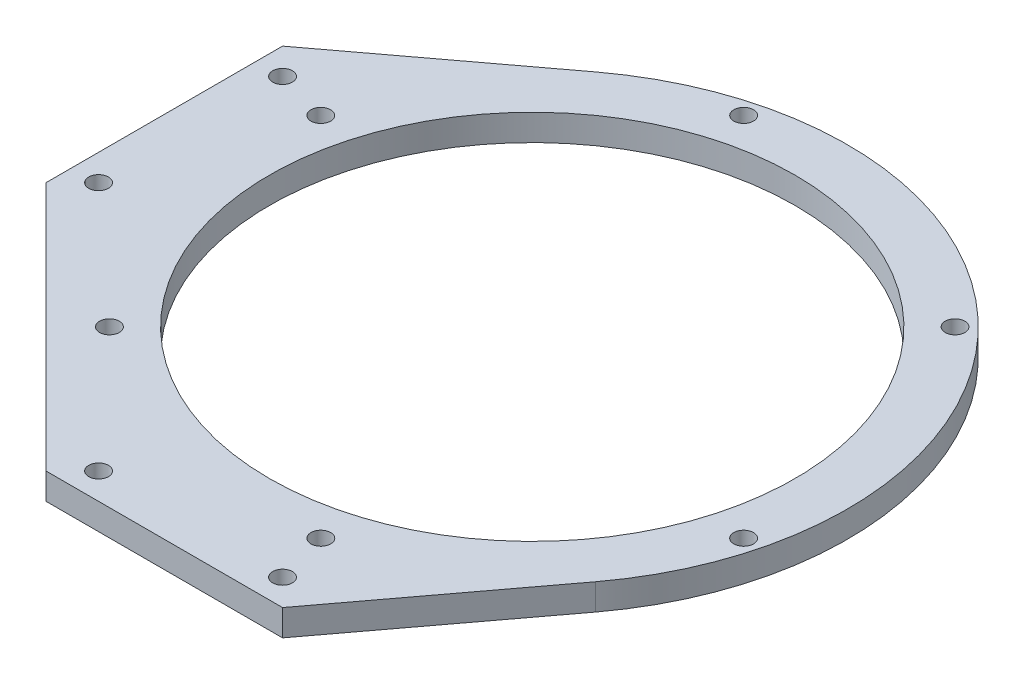
ISO-10303-21;
HEADER;
FILE_DESCRIPTION(('STEP AP214'),'2;1');
FILE_NAME('part.step','',(''),(''),'','','');
FILE_SCHEMA(('AUTOMOTIVE_DESIGN { 1 0 10303 214 1 1 1 1 }'));
ENDSEC;
DATA;
#1=APPLICATION_CONTEXT('core data for automotive mechanical design processes');
#2=APPLICATION_PROTOCOL_DEFINITION('international standard','automotive_design',2000,#1);
#3=PRODUCT_CONTEXT('',#1,'mechanical');
#4=PRODUCT('Part','Part','',(#3));
#5=PRODUCT_RELATED_PRODUCT_CATEGORY('part','',(#4));
#6=PRODUCT_DEFINITION_FORMATION('','',#4);
#7=PRODUCT_DEFINITION_CONTEXT('part definition',#1,'design');
#8=PRODUCT_DEFINITION('design','',#6,#7);
#9=PRODUCT_DEFINITION_SHAPE('','',#8);
#10=(LENGTH_UNIT() NAMED_UNIT(*) SI_UNIT(.MILLI.,.METRE.));
#11=(NAMED_UNIT(*) PLANE_ANGLE_UNIT() SI_UNIT($,.RADIAN.));
#12=(NAMED_UNIT(*) SI_UNIT($,.STERADIAN.) SOLID_ANGLE_UNIT());
#13=UNCERTAINTY_MEASURE_WITH_UNIT(LENGTH_MEASURE(1.E-05),#10,'distance_accuracy_value','');
#14=(GEOMETRIC_REPRESENTATION_CONTEXT(3) GLOBAL_UNCERTAINTY_ASSIGNED_CONTEXT((#13)) GLOBAL_UNIT_ASSIGNED_CONTEXT((#10,
#11,#12)) REPRESENTATION_CONTEXT('',''));
#15=CARTESIAN_POINT('',(0.,0.,0.));
#16=DIRECTION('',(0.,0.,1.));
#17=DIRECTION('',(1.,0.,0.));
#18=AXIS2_PLACEMENT_3D('',#15,#16,#17);
#19=CARTESIAN_POINT('',(0.,4.,0.));
#20=DIRECTION('',(0.,-1.,0.));
#21=DIRECTION('',(0.,0.,-1.));
#22=AXIS2_PLACEMENT_3D('',#19,#20,#21);
#23=PLANE('',#22);
#24=DIRECTION('',(-0.8,0.,0.599999999999999));
#25=VECTOR('',#24,1.);
#26=CARTESIAN_POINT('',(-56.,4.,-18.));
#27=LINE('',#26,#25);
#28=CARTESIAN_POINT('',(-28.8,4.,-38.4));
#29=VERTEX_POINT('',#28);
#30=CARTESIAN_POINT('',(-56.,4.,-18.));
#31=VERTEX_POINT('',#30);
#32=EDGE_CURVE('E131',#29,#31,#27,.T.);
#33=ORIENTED_EDGE('',*,*,#32,.T.);
#34=DIRECTION('',(0.,0.,1.));
#35=VECTOR('',#34,1.);
#36=CARTESIAN_POINT('',(-56.,4.,-18.));
#37=LINE('',#36,#35);
#38=CARTESIAN_POINT('',(-56.,4.,18.));
#39=VERTEX_POINT('',#38);
#40=EDGE_CURVE('E91',#31,#39,#37,.T.);
#41=ORIENTED_EDGE('',*,*,#40,.T.);
#42=DIRECTION('',(0.707106781186548,0.,0.707106781186548));
#43=VECTOR('',#42,1.);
#44=CARTESIAN_POINT('',(-56.,4.,18.));
#45=LINE('',#44,#43);
#46=CARTESIAN_POINT('',(-18.,4.,56.));
#47=VERTEX_POINT('',#46);
#48=EDGE_CURVE('E106',#39,#47,#45,.T.);
#49=ORIENTED_EDGE('',*,*,#48,.T.);
#50=DIRECTION('',(1.,0.,0.));
#51=VECTOR('',#50,1.);
#52=CARTESIAN_POINT('',(18.,4.,56.));
#53=LINE('',#52,#51);
#54=CARTESIAN_POINT('',(18.,4.,56.));
#55=VERTEX_POINT('',#54);
#56=EDGE_CURVE('E99',#47,#55,#53,.T.);
#57=ORIENTED_EDGE('',*,*,#56,.T.);
#58=DIRECTION('',(0.599999999999999,0.,-0.800000000000001));
#59=VECTOR('',#58,1.);
#60=CARTESIAN_POINT('',(18.,4.,56.));
#61=LINE('',#60,#59);
#62=CARTESIAN_POINT('',(38.4,4.,28.8));
#63=VERTEX_POINT('',#62);
#64=EDGE_CURVE('E102',#55,#63,#61,.T.);
#65=ORIENTED_EDGE('',*,*,#64,.T.);
#66=CARTESIAN_POINT('',(0.,4.,0.));
#67=DIRECTION('',(0.,1.,0.));
#68=DIRECTION('',(0.,0.,-1.));
#69=AXIS2_PLACEMENT_3D('',#66,#67,#68);
#70=CIRCLE('',#69,47.9999999999999);
#71=EDGE_CURVE('E57',#63,#29,#70,.T.);
#72=ORIENTED_EDGE('',*,*,#71,.T.);
#73=EDGE_LOOP('',(#33,#41,#49,#57,#65,#72));
#74=FACE_BOUND('',#73,.T.);
#75=CARTESIAN_POINT('',(0.,4.,0.));
#76=DIRECTION('',(0.,1.,0.));
#77=DIRECTION('',(0.,0.,1.));
#78=AXIS2_PLACEMENT_3D('',#75,#76,#77);
#79=CIRCLE('',#78,40.);
#80=CARTESIAN_POINT('',(0.,4.,40.));
#81=VERTEX_POINT('',#80);
#82=EDGE_CURVE('E126',#81,#81,#79,.T.);
#83=ORIENTED_EDGE('',*,*,#82,.F.);
#84=EDGE_LOOP('',(#83));
#85=FACE_BOUND('',#84,.T.);
#86=CARTESIAN_POINT('',(32.1733585439879,4.,-32.1733585439879));
#87=DIRECTION('',(0.,1.,0.));
#88=DIRECTION('',(0.,0.,1.));
#89=AXIS2_PLACEMENT_3D('',#86,#87,#88);
#90=CIRCLE('',#89,1.5);
#91=CARTESIAN_POINT('',(32.1733585439879,4.,-30.6733585439879));
#92=VERTEX_POINT('',#91);
#93=EDGE_CURVE('E267',#92,#92,#90,.T.);
#94=ORIENTED_EDGE('',*,*,#93,.F.);
#95=EDGE_LOOP('',(#94));
#96=FACE_BOUND('',#95,.T.);
#97=CARTESIAN_POINT('',(43.9496250961526,4.,11.7762665521646));
#98=DIRECTION('',(0.,1.,0.));
#99=DIRECTION('',(0.,0.,1.));
#100=AXIS2_PLACEMENT_3D('',#97,#98,#99);
#101=CIRCLE('',#100,1.50000000000001);
#102=CARTESIAN_POINT('',(43.9496250961526,4.,13.2762665521647));
#103=VERTEX_POINT('',#102);
#104=EDGE_CURVE('E263',#103,#103,#101,.T.);
#105=ORIENTED_EDGE('',*,*,#104,.F.);
#106=EDGE_LOOP('',(#105));
#107=FACE_BOUND('',#106,.T.);
#108=CARTESIAN_POINT('',(11.7762665521647,4.,43.9496250961526));
#109=DIRECTION('',(0.,1.,0.));
#110=DIRECTION('',(0.,0.,1.));
#111=AXIS2_PLACEMENT_3D('',#108,#109,#110);
#112=CIRCLE('',#111,1.50000000000001);
#113=CARTESIAN_POINT('',(11.7762665521647,4.,45.4496250961526));
#114=VERTEX_POINT('',#113);
#115=EDGE_CURVE('E260',#114,#114,#112,.T.);
#116=ORIENTED_EDGE('',*,*,#115,.F.);
#117=EDGE_LOOP('',(#116));
#118=FACE_BOUND('',#117,.T.);
#119=CARTESIAN_POINT('',(-32.1733585439879,4.,32.1733585439879));
#120=DIRECTION('',(0.,1.,0.));
#121=DIRECTION('',(0.,0.,1.));
#122=AXIS2_PLACEMENT_3D('',#119,#120,#121);
#123=CIRCLE('',#122,1.50000000000001);
#124=CARTESIAN_POINT('',(-32.1733585439879,4.,33.6733585439879));
#125=VERTEX_POINT('',#124);
#126=EDGE_CURVE('E253',#125,#125,#123,.T.);
#127=ORIENTED_EDGE('',*,*,#126,.F.);
#128=EDGE_LOOP('',(#127));
#129=FACE_BOUND('',#128,.T.);
#130=CARTESIAN_POINT('',(-43.9496250961526,4.,-11.7762665521646));
#131=DIRECTION('',(0.,1.,0.));
#132=DIRECTION('',(0.,0.,1.));
#133=AXIS2_PLACEMENT_3D('',#130,#131,#132);
#134=CIRCLE('',#133,1.50000000000001);
#135=CARTESIAN_POINT('',(-43.9496250961526,4.,-10.2762665521646));
#136=VERTEX_POINT('',#135);
#137=EDGE_CURVE('E241',#136,#136,#134,.T.);
#138=ORIENTED_EDGE('',*,*,#137,.F.);
#139=EDGE_LOOP('',(#138));
#140=FACE_BOUND('',#139,.T.);
#141=CARTESIAN_POINT('',(-11.7762665521648,4.,-43.9496250961526));
#142=DIRECTION('',(0.,1.,0.));
#143=DIRECTION('',(0.,0.,1.));
#144=AXIS2_PLACEMENT_3D('',#141,#142,#143);
#145=CIRCLE('',#144,1.5);
#146=CARTESIAN_POINT('',(-11.7762665521648,4.,-42.4496250961526));
#147=VERTEX_POINT('',#146);
#148=EDGE_CURVE('E239',#147,#147,#145,.T.);
#149=ORIENTED_EDGE('',*,*,#148,.F.);
#150=EDGE_LOOP('',(#149));
#151=FACE_BOUND('',#150,.T.);
#152=CARTESIAN_POINT('',(-14.,4.,52.));
#153=DIRECTION('',(0.,1.,0.));
#154=DIRECTION('',(0.,0.,1.));
#155=AXIS2_PLACEMENT_3D('',#152,#153,#154);
#156=CIRCLE('',#155,1.5);
#157=CARTESIAN_POINT('',(-14.,4.,53.5));
#158=VERTEX_POINT('',#157);
#159=EDGE_CURVE('E234',#158,#158,#156,.T.);
#160=ORIENTED_EDGE('',*,*,#159,.F.);
#161=EDGE_LOOP('',(#160));
#162=FACE_BOUND('',#161,.T.);
#163=CARTESIAN_POINT('',(14.,4.,52.));
#164=DIRECTION('',(0.,1.,0.));
#165=DIRECTION('',(0.,0.,-1.));
#166=AXIS2_PLACEMENT_3D('',#163,#164,#165);
#167=CIRCLE('',#166,1.5);
#168=CARTESIAN_POINT('',(14.,4.,50.5));
#169=VERTEX_POINT('',#168);
#170=EDGE_CURVE('E229',#169,#169,#167,.T.);
#171=ORIENTED_EDGE('',*,*,#170,.F.);
#172=EDGE_LOOP('',(#171));
#173=FACE_BOUND('',#172,.T.);
#174=CARTESIAN_POINT('',(-52.,4.,14.));
#175=DIRECTION('',(0.,1.,0.));
#176=DIRECTION('',(0.,0.,-1.));
#177=AXIS2_PLACEMENT_3D('',#174,#175,#176);
#178=CIRCLE('',#177,1.5);
#179=CARTESIAN_POINT('',(-52.,4.,12.5));
#180=VERTEX_POINT('',#179);
#181=EDGE_CURVE('E222',#180,#180,#178,.T.);
#182=ORIENTED_EDGE('',*,*,#181,.F.);
#183=EDGE_LOOP('',(#182));
#184=FACE_BOUND('',#183,.T.);
#185=CARTESIAN_POINT('',(-52.,4.,-14.));
#186=DIRECTION('',(0.,1.,0.));
#187=DIRECTION('',(0.,0.,1.));
#188=AXIS2_PLACEMENT_3D('',#185,#186,#187);
#189=CIRCLE('',#188,1.5);
#190=CARTESIAN_POINT('',(-52.,4.,-12.5));
#191=VERTEX_POINT('',#190);
#192=EDGE_CURVE('E215',#191,#191,#189,.T.);
#193=ORIENTED_EDGE('',*,*,#192,.F.);
#194=EDGE_LOOP('',(#193));
#195=FACE_BOUND('',#194,.T.);
#196=ADVANCED_FACE('F39',(#74,#85,#96,#107,#118,#129,#140,#151,#162,#173,#184,#195),#23,.F.);
#197=CARTESIAN_POINT('',(0.,0.,0.));
#198=DIRECTION('',(0.,-1.,0.));
#199=DIRECTION('',(0.,0.,-1.));
#200=AXIS2_PLACEMENT_3D('',#197,#198,#199);
#201=PLANE('',#200);
#202=CARTESIAN_POINT('',(-52.,0.,14.));
#203=DIRECTION('',(0.,1.,0.));
#204=DIRECTION('',(0.,0.,-1.));
#205=AXIS2_PLACEMENT_3D('',#202,#203,#204);
#206=CIRCLE('',#205,1.5);
#207=CARTESIAN_POINT('',(-52.,0.,12.5));
#208=VERTEX_POINT('',#207);
#209=EDGE_CURVE('E217',#208,#208,#206,.T.);
#210=ORIENTED_EDGE('',*,*,#209,.T.);
#211=EDGE_LOOP('',(#210));
#212=FACE_BOUND('',#211,.T.);
#213=CARTESIAN_POINT('',(-14.,0.,52.));
#214=DIRECTION('',(0.,1.,0.));
#215=DIRECTION('',(0.,0.,1.));
#216=AXIS2_PLACEMENT_3D('',#213,#214,#215);
#217=CIRCLE('',#216,1.5);
#218=CARTESIAN_POINT('',(-14.,0.,53.5));
#219=VERTEX_POINT('',#218);
#220=EDGE_CURVE('E226',#219,#219,#217,.T.);
#221=ORIENTED_EDGE('',*,*,#220,.T.);
#222=EDGE_LOOP('',(#221));
#223=FACE_BOUND('',#222,.T.);
#224=CARTESIAN_POINT('',(-43.9496250961526,0.,-11.7762665521646));
#225=DIRECTION('',(0.,1.,0.));
#226=DIRECTION('',(0.,0.,1.));
#227=AXIS2_PLACEMENT_3D('',#224,#225,#226);
#228=CIRCLE('',#227,1.50000000000001);
#229=CARTESIAN_POINT('',(-43.9496250961526,0.,-10.2762665521646));
#230=VERTEX_POINT('',#229);
#231=EDGE_CURVE('E244',#230,#230,#228,.T.);
#232=ORIENTED_EDGE('',*,*,#231,.T.);
#233=EDGE_LOOP('',(#232));
#234=FACE_BOUND('',#233,.T.);
#235=CARTESIAN_POINT('',(11.7762665521647,0.,43.9496250961526));
#236=DIRECTION('',(0.,1.,0.));
#237=DIRECTION('',(0.,0.,1.));
#238=AXIS2_PLACEMENT_3D('',#235,#236,#237);
#239=CIRCLE('',#238,1.50000000000001);
#240=CARTESIAN_POINT('',(11.7762665521647,0.,45.4496250961526));
#241=VERTEX_POINT('',#240);
#242=EDGE_CURVE('E255',#241,#241,#239,.T.);
#243=ORIENTED_EDGE('',*,*,#242,.T.);
#244=EDGE_LOOP('',(#243));
#245=FACE_BOUND('',#244,.T.);
#246=CARTESIAN_POINT('',(32.1733585439879,0.,-32.1733585439879));
#247=DIRECTION('',(0.,1.,0.));
#248=DIRECTION('',(0.,0.,1.));
#249=AXIS2_PLACEMENT_3D('',#246,#247,#248);
#250=CIRCLE('',#249,1.5);
#251=CARTESIAN_POINT('',(32.1733585439879,0.,-30.6733585439879));
#252=VERTEX_POINT('',#251);
#253=EDGE_CURVE('E266',#252,#252,#250,.T.);
#254=ORIENTED_EDGE('',*,*,#253,.T.);
#255=EDGE_LOOP('',(#254));
#256=FACE_BOUND('',#255,.T.);
#257=DIRECTION('',(-0.8,0.,0.599999999999999));
#258=VECTOR('',#257,1.);
#259=CARTESIAN_POINT('',(-56.,0.,-18.));
#260=LINE('',#259,#258);
#261=CARTESIAN_POINT('',(-28.8,0.,-38.4));
#262=VERTEX_POINT('',#261);
#263=CARTESIAN_POINT('',(-56.,0.,-18.));
#264=VERTEX_POINT('',#263);
#265=EDGE_CURVE('E121',#262,#264,#260,.T.);
#266=ORIENTED_EDGE('',*,*,#265,.F.);
#267=CARTESIAN_POINT('',(0.,0.,0.));
#268=DIRECTION('',(0.,1.,0.));
#269=DIRECTION('',(0.,0.,-1.));
#270=AXIS2_PLACEMENT_3D('',#267,#268,#269);
#271=CIRCLE('',#270,47.9999999999999);
#272=CARTESIAN_POINT('',(38.4,0.,28.8));
#273=VERTEX_POINT('',#272);
#274=EDGE_CURVE('E83',#273,#262,#271,.T.);
#275=ORIENTED_EDGE('',*,*,#274,.F.);
#276=DIRECTION('',(0.599999999999999,0.,-0.800000000000001));
#277=VECTOR('',#276,1.);
#278=CARTESIAN_POINT('',(18.,0.,56.));
#279=LINE('',#278,#277);
#280=CARTESIAN_POINT('',(18.,0.,56.));
#281=VERTEX_POINT('',#280);
#282=EDGE_CURVE('E80',#281,#273,#279,.T.);
#283=ORIENTED_EDGE('',*,*,#282,.F.);
#284=DIRECTION('',(1.,0.,0.));
#285=VECTOR('',#284,1.);
#286=CARTESIAN_POINT('',(18.,0.,56.));
#287=LINE('',#286,#285);
#288=CARTESIAN_POINT('',(-18.,0.,56.));
#289=VERTEX_POINT('',#288);
#290=EDGE_CURVE('E111',#289,#281,#287,.T.);
#291=ORIENTED_EDGE('',*,*,#290,.F.);
#292=DIRECTION('',(0.707106781186548,0.,0.707106781186548));
#293=VECTOR('',#292,1.);
#294=CARTESIAN_POINT('',(-56.,0.,18.));
#295=LINE('',#294,#293);
#296=CARTESIAN_POINT('',(-56.,0.,18.));
#297=VERTEX_POINT('',#296);
#298=EDGE_CURVE('E128',#297,#289,#295,.T.);
#299=ORIENTED_EDGE('',*,*,#298,.F.);
#300=DIRECTION('',(0.,0.,1.));
#301=VECTOR('',#300,1.);
#302=CARTESIAN_POINT('',(-56.,0.,-18.));
#303=LINE('',#302,#301);
#304=EDGE_CURVE('E130',#264,#297,#303,.T.);
#305=ORIENTED_EDGE('',*,*,#304,.F.);
#306=EDGE_LOOP('',(#266,#275,#283,#291,#299,#305));
#307=FACE_BOUND('',#306,.T.);
#308=CARTESIAN_POINT('',(0.,0.,0.));
#309=DIRECTION('',(0.,1.,0.));
#310=DIRECTION('',(0.,0.,1.));
#311=AXIS2_PLACEMENT_3D('',#308,#309,#310);
#312=CIRCLE('',#311,40.);
#313=CARTESIAN_POINT('',(0.,0.,40.));
#314=VERTEX_POINT('',#313);
#315=EDGE_CURVE('E275',#314,#314,#312,.T.);
#316=ORIENTED_EDGE('',*,*,#315,.T.);
#317=EDGE_LOOP('',(#316));
#318=FACE_BOUND('',#317,.T.);
#319=CARTESIAN_POINT('',(43.9496250961526,0.,11.7762665521646));
#320=DIRECTION('',(0.,1.,0.));
#321=DIRECTION('',(0.,0.,1.));
#322=AXIS2_PLACEMENT_3D('',#319,#320,#321);
#323=CIRCLE('',#322,1.50000000000001);
#324=CARTESIAN_POINT('',(43.9496250961526,0.,13.2762665521647));
#325=VERTEX_POINT('',#324);
#326=EDGE_CURVE('E257',#325,#325,#323,.T.);
#327=ORIENTED_EDGE('',*,*,#326,.T.);
#328=EDGE_LOOP('',(#327));
#329=FACE_BOUND('',#328,.T.);
#330=CARTESIAN_POINT('',(-32.1733585439879,0.,32.1733585439879));
#331=DIRECTION('',(0.,1.,0.));
#332=DIRECTION('',(0.,0.,1.));
#333=AXIS2_PLACEMENT_3D('',#330,#331,#332);
#334=CIRCLE('',#333,1.50000000000001);
#335=CARTESIAN_POINT('',(-32.1733585439879,0.,33.6733585439879));
#336=VERTEX_POINT('',#335);
#337=EDGE_CURVE('E249',#336,#336,#334,.T.);
#338=ORIENTED_EDGE('',*,*,#337,.T.);
#339=EDGE_LOOP('',(#338));
#340=FACE_BOUND('',#339,.T.);
#341=CARTESIAN_POINT('',(-11.7762665521648,0.,-43.9496250961526));
#342=DIRECTION('',(0.,1.,0.));
#343=DIRECTION('',(0.,0.,1.));
#344=AXIS2_PLACEMENT_3D('',#341,#342,#343);
#345=CIRCLE('',#344,1.5);
#346=CARTESIAN_POINT('',(-11.7762665521648,0.,-42.4496250961526));
#347=VERTEX_POINT('',#346);
#348=EDGE_CURVE('E237',#347,#347,#345,.T.);
#349=ORIENTED_EDGE('',*,*,#348,.T.);
#350=EDGE_LOOP('',(#349));
#351=FACE_BOUND('',#350,.T.);
#352=CARTESIAN_POINT('',(14.,0.,52.));
#353=DIRECTION('',(0.,1.,0.));
#354=DIRECTION('',(0.,0.,-1.));
#355=AXIS2_PLACEMENT_3D('',#352,#353,#354);
#356=CIRCLE('',#355,1.5);
#357=CARTESIAN_POINT('',(14.,0.,50.5));
#358=VERTEX_POINT('',#357);
#359=EDGE_CURVE('E221',#358,#358,#356,.T.);
#360=ORIENTED_EDGE('',*,*,#359,.T.);
#361=EDGE_LOOP('',(#360));
#362=FACE_BOUND('',#361,.T.);
#363=CARTESIAN_POINT('',(-52.,0.,-14.));
#364=DIRECTION('',(0.,1.,0.));
#365=DIRECTION('',(0.,0.,1.));
#366=AXIS2_PLACEMENT_3D('',#363,#364,#365);
#367=CIRCLE('',#366,1.5);
#368=CARTESIAN_POINT('',(-52.,0.,-12.5));
#369=VERTEX_POINT('',#368);
#370=EDGE_CURVE('E214',#369,#369,#367,.T.);
#371=ORIENTED_EDGE('',*,*,#370,.T.);
#372=EDGE_LOOP('',(#371));
#373=FACE_BOUND('',#372,.T.);
#374=ADVANCED_FACE('F145',(#212,#223,#234,#245,#256,#307,#318,#329,#340,#351,#362,#373),#201,.T.);
#375=CARTESIAN_POINT('',(-56.,4.,-18.));
#376=DIRECTION('',(0.6,0.,0.800000000000001));
#377=DIRECTION('',(0.8,0.,-0.599999999999999));
#378=AXIS2_PLACEMENT_3D('',#375,#376,#377);
#379=PLANE('',#378);
#380=ORIENTED_EDGE('',*,*,#265,.T.);
#381=DIRECTION('',(0.,-1.,0.));
#382=VECTOR('',#381,1.);
#383=CARTESIAN_POINT('',(-56.,4.,-18.));
#384=LINE('',#383,#382);
#385=EDGE_CURVE('E11',#31,#264,#384,.T.);
#386=ORIENTED_EDGE('',*,*,#385,.F.);
#387=ORIENTED_EDGE('',*,*,#32,.F.);
#388=DIRECTION('',(0.,-1.,0.));
#389=VECTOR('',#388,1.);
#390=CARTESIAN_POINT('',(-28.8,4.,-38.4));
#391=LINE('',#390,#389);
#392=EDGE_CURVE('E116',#29,#262,#391,.T.);
#393=ORIENTED_EDGE('',*,*,#392,.T.);
#394=EDGE_LOOP('',(#380,#386,#387,#393));
#395=FACE_BOUND('',#394,.T.);
#396=ADVANCED_FACE('F41',(#395),#379,.F.);
#397=CARTESIAN_POINT('',(-56.,4.,-18.));
#398=DIRECTION('',(1.,0.,0.));
#399=DIRECTION('',(0.,0.,-1.));
#400=AXIS2_PLACEMENT_3D('',#397,#398,#399);
#401=PLANE('',#400);
#402=ORIENTED_EDGE('',*,*,#304,.T.);
#403=DIRECTION('',(0.,-1.,0.));
#404=VECTOR('',#403,1.);
#405=CARTESIAN_POINT('',(-56.,4.,18.));
#406=LINE('',#405,#404);
#407=EDGE_CURVE('E48',#39,#297,#406,.T.);
#408=ORIENTED_EDGE('',*,*,#407,.F.);
#409=ORIENTED_EDGE('',*,*,#40,.F.);
#410=ORIENTED_EDGE('',*,*,#385,.T.);
#411=EDGE_LOOP('',(#402,#408,#409,#410));
#412=FACE_BOUND('',#411,.T.);
#413=ADVANCED_FACE('F390',(#412),#401,.F.);
#414=CARTESIAN_POINT('',(-56.,4.,18.));
#415=DIRECTION('',(0.707106781186547,0.,-0.707106781186547));
#416=DIRECTION('',(-0.707106781186548,0.,-0.707106781186548));
#417=AXIS2_PLACEMENT_3D('',#414,#415,#416);
#418=PLANE('',#417);
#419=ORIENTED_EDGE('',*,*,#298,.T.);
#420=DIRECTION('',(0.,-1.,0.));
#421=VECTOR('',#420,1.);
#422=CARTESIAN_POINT('',(-18.,4.,56.));
#423=LINE('',#422,#421);
#424=EDGE_CURVE('E113',#47,#289,#423,.T.);
#425=ORIENTED_EDGE('',*,*,#424,.F.);
#426=ORIENTED_EDGE('',*,*,#48,.F.);
#427=ORIENTED_EDGE('',*,*,#407,.T.);
#428=EDGE_LOOP('',(#419,#425,#426,#427));
#429=FACE_BOUND('',#428,.T.);
#430=ADVANCED_FACE('F143',(#429),#418,.F.);
#431=CARTESIAN_POINT('',(18.,4.,56.));
#432=DIRECTION('',(0.,0.,-1.));
#433=DIRECTION('',(-1.,0.,0.));
#434=AXIS2_PLACEMENT_3D('',#431,#432,#433);
#435=PLANE('',#434);
#436=ORIENTED_EDGE('',*,*,#290,.T.);
#437=DIRECTION('',(0.,-1.,0.));
#438=VECTOR('',#437,1.);
#439=CARTESIAN_POINT('',(18.,4.,56.));
#440=LINE('',#439,#438);
#441=EDGE_CURVE('E112',#55,#281,#440,.T.);
#442=ORIENTED_EDGE('',*,*,#441,.F.);
#443=ORIENTED_EDGE('',*,*,#56,.F.);
#444=ORIENTED_EDGE('',*,*,#424,.T.);
#445=EDGE_LOOP('',(#436,#442,#443,#444));
#446=FACE_BOUND('',#445,.T.);
#447=ADVANCED_FACE('F115',(#446),#435,.F.);
#448=CARTESIAN_POINT('',(18.,4.,56.));
#449=DIRECTION('',(-0.800000000000001,0.,-0.599999999999999));
#450=DIRECTION('',(-0.599999999999999,0.,0.800000000000001));
#451=AXIS2_PLACEMENT_3D('',#448,#449,#450);
#452=PLANE('',#451);
#453=ORIENTED_EDGE('',*,*,#282,.T.);
#454=DIRECTION('',(0.,-1.,0.));
#455=VECTOR('',#454,1.);
#456=CARTESIAN_POINT('',(38.4,4.,28.8));
#457=LINE('',#456,#455);
#458=EDGE_CURVE('E118',#63,#273,#457,.T.);
#459=ORIENTED_EDGE('',*,*,#458,.F.);
#460=ORIENTED_EDGE('',*,*,#64,.F.);
#461=ORIENTED_EDGE('',*,*,#441,.T.);
#462=EDGE_LOOP('',(#453,#459,#460,#461));
#463=FACE_BOUND('',#462,.T.);
#464=ADVANCED_FACE('F117',(#463),#452,.F.);
#465=CARTESIAN_POINT('',(0.,4.,0.));
#466=DIRECTION('',(0.,-1.,0.));
#467=DIRECTION('',(0.,0.,-1.));
#468=AXIS2_PLACEMENT_3D('',#465,#466,#467);
#469=CYLINDRICAL_SURFACE('',#468,47.9999999999999);
#470=ORIENTED_EDGE('',*,*,#274,.T.);
#471=ORIENTED_EDGE('',*,*,#392,.F.);
#472=ORIENTED_EDGE('',*,*,#71,.F.);
#473=ORIENTED_EDGE('',*,*,#458,.T.);
#474=EDGE_LOOP('',(#470,#471,#472,#473));
#475=FACE_BOUND('',#474,.T.);
#476=ADVANCED_FACE('F149',(#475),#469,.T.);
#477=CARTESIAN_POINT('',(0.,4.,0.));
#478=DIRECTION('',(0.,-1.,0.));
#479=DIRECTION('',(0.,0.,-1.));
#480=AXIS2_PLACEMENT_3D('',#477,#478,#479);
#481=CYLINDRICAL_SURFACE('',#480,40.);
#482=ORIENTED_EDGE('',*,*,#82,.T.);
#483=EDGE_LOOP('',(#482));
#484=FACE_BOUND('',#483,.T.);
#485=ORIENTED_EDGE('',*,*,#315,.F.);
#486=EDGE_LOOP('',(#485));
#487=FACE_BOUND('',#486,.T.);
#488=ADVANCED_FACE('F151',(#484,#487),#481,.F.);
#489=CARTESIAN_POINT('',(32.1733585439879,4.,-32.1733585439879));
#490=DIRECTION('',(0.,-1.,0.));
#491=DIRECTION('',(0.,0.,-1.));
#492=AXIS2_PLACEMENT_3D('',#489,#490,#491);
#493=CYLINDRICAL_SURFACE('',#492,1.5);
#494=ORIENTED_EDGE('',*,*,#93,.T.);
#495=EDGE_LOOP('',(#494));
#496=FACE_BOUND('',#495,.T.);
#497=ORIENTED_EDGE('',*,*,#253,.F.);
#498=EDGE_LOOP('',(#497));
#499=FACE_BOUND('',#498,.T.);
#500=ADVANCED_FACE('F160',(#496,#499),#493,.F.);
#501=CARTESIAN_POINT('',(43.9496250961526,4.,11.7762665521646));
#502=DIRECTION('',(0.,-1.,0.));
#503=DIRECTION('',(0.,0.,-1.));
#504=AXIS2_PLACEMENT_3D('',#501,#502,#503);
#505=CYLINDRICAL_SURFACE('',#504,1.50000000000001);
#506=ORIENTED_EDGE('',*,*,#104,.T.);
#507=EDGE_LOOP('',(#506));
#508=FACE_BOUND('',#507,.T.);
#509=ORIENTED_EDGE('',*,*,#326,.F.);
#510=EDGE_LOOP('',(#509));
#511=FACE_BOUND('',#510,.T.);
#512=ADVANCED_FACE('F173',(#508,#511),#505,.F.);
#513=CARTESIAN_POINT('',(11.7762665521647,4.,43.9496250961526));
#514=DIRECTION('',(0.,-1.,0.));
#515=DIRECTION('',(0.,0.,-1.));
#516=AXIS2_PLACEMENT_3D('',#513,#514,#515);
#517=CYLINDRICAL_SURFACE('',#516,1.50000000000001);
#518=ORIENTED_EDGE('',*,*,#115,.T.);
#519=EDGE_LOOP('',(#518));
#520=FACE_BOUND('',#519,.T.);
#521=ORIENTED_EDGE('',*,*,#242,.F.);
#522=EDGE_LOOP('',(#521));
#523=FACE_BOUND('',#522,.T.);
#524=ADVANCED_FACE('F171',(#520,#523),#517,.F.);
#525=CARTESIAN_POINT('',(-32.1733585439879,4.,32.1733585439879));
#526=DIRECTION('',(0.,-1.,0.));
#527=DIRECTION('',(0.,0.,-1.));
#528=AXIS2_PLACEMENT_3D('',#525,#526,#527);
#529=CYLINDRICAL_SURFACE('',#528,1.50000000000001);
#530=ORIENTED_EDGE('',*,*,#126,.T.);
#531=EDGE_LOOP('',(#530));
#532=FACE_BOUND('',#531,.T.);
#533=ORIENTED_EDGE('',*,*,#337,.F.);
#534=EDGE_LOOP('',(#533));
#535=FACE_BOUND('',#534,.T.);
#536=ADVANCED_FACE('F176',(#532,#535),#529,.F.);
#537=CARTESIAN_POINT('',(-43.9496250961526,4.,-11.7762665521646));
#538=DIRECTION('',(0.,-1.,0.));
#539=DIRECTION('',(0.,0.,-1.));
#540=AXIS2_PLACEMENT_3D('',#537,#538,#539);
#541=CYLINDRICAL_SURFACE('',#540,1.50000000000001);
#542=ORIENTED_EDGE('',*,*,#137,.T.);
#543=EDGE_LOOP('',(#542));
#544=FACE_BOUND('',#543,.T.);
#545=ORIENTED_EDGE('',*,*,#231,.F.);
#546=EDGE_LOOP('',(#545));
#547=FACE_BOUND('',#546,.T.);
#548=ADVANCED_FACE('F181',(#544,#547),#541,.F.);
#549=CARTESIAN_POINT('',(-11.7762665521648,4.,-43.9496250961526));
#550=DIRECTION('',(0.,-1.,0.));
#551=DIRECTION('',(0.,0.,-1.));
#552=AXIS2_PLACEMENT_3D('',#549,#550,#551);
#553=CYLINDRICAL_SURFACE('',#552,1.5);
#554=ORIENTED_EDGE('',*,*,#148,.T.);
#555=EDGE_LOOP('',(#554));
#556=FACE_BOUND('',#555,.T.);
#557=ORIENTED_EDGE('',*,*,#348,.F.);
#558=EDGE_LOOP('',(#557));
#559=FACE_BOUND('',#558,.T.);
#560=ADVANCED_FACE('F189',(#556,#559),#553,.F.);
#561=CARTESIAN_POINT('',(-14.,4.,52.));
#562=DIRECTION('',(0.,-1.,0.));
#563=DIRECTION('',(0.,0.,-1.));
#564=AXIS2_PLACEMENT_3D('',#561,#562,#563);
#565=CYLINDRICAL_SURFACE('',#564,1.5);
#566=ORIENTED_EDGE('',*,*,#159,.T.);
#567=EDGE_LOOP('',(#566));
#568=FACE_BOUND('',#567,.T.);
#569=ORIENTED_EDGE('',*,*,#220,.F.);
#570=EDGE_LOOP('',(#569));
#571=FACE_BOUND('',#570,.T.);
#572=ADVANCED_FACE('F192',(#568,#571),#565,.F.);
#573=CARTESIAN_POINT('',(14.,4.,52.));
#574=DIRECTION('',(0.,-1.,0.));
#575=DIRECTION('',(0.,0.,-1.));
#576=AXIS2_PLACEMENT_3D('',#573,#574,#575);
#577=CYLINDRICAL_SURFACE('',#576,1.5);
#578=ORIENTED_EDGE('',*,*,#170,.T.);
#579=EDGE_LOOP('',(#578));
#580=FACE_BOUND('',#579,.T.);
#581=ORIENTED_EDGE('',*,*,#359,.F.);
#582=EDGE_LOOP('',(#581));
#583=FACE_BOUND('',#582,.T.);
#584=ADVANCED_FACE('F193',(#580,#583),#577,.F.);
#585=CARTESIAN_POINT('',(-52.,4.,14.));
#586=DIRECTION('',(0.,-1.,0.));
#587=DIRECTION('',(0.,0.,-1.));
#588=AXIS2_PLACEMENT_3D('',#585,#586,#587);
#589=CYLINDRICAL_SURFACE('',#588,1.5);
#590=ORIENTED_EDGE('',*,*,#181,.T.);
#591=EDGE_LOOP('',(#590));
#592=FACE_BOUND('',#591,.T.);
#593=ORIENTED_EDGE('',*,*,#209,.F.);
#594=EDGE_LOOP('',(#593));
#595=FACE_BOUND('',#594,.T.);
#596=ADVANCED_FACE('F200',(#592,#595),#589,.F.);
#597=CARTESIAN_POINT('',(-52.,4.,-14.));
#598=DIRECTION('',(0.,-1.,0.));
#599=DIRECTION('',(0.,0.,-1.));
#600=AXIS2_PLACEMENT_3D('',#597,#598,#599);
#601=CYLINDRICAL_SURFACE('',#600,1.5);
#602=ORIENTED_EDGE('',*,*,#192,.T.);
#603=EDGE_LOOP('',(#602));
#604=FACE_BOUND('',#603,.T.);
#605=ORIENTED_EDGE('',*,*,#370,.F.);
#606=EDGE_LOOP('',(#605));
#607=FACE_BOUND('',#606,.T.);
#608=ADVANCED_FACE('F201',(#604,#607),#601,.F.);
#609=CLOSED_SHELL('',(#196,#374,#396,#413,#430,#447,#464,#476,#488,#500,#512,#524,#536,#548,
#560,#572,#584,#596,#608));
#610=MANIFOLD_SOLID_BREP('B2',#609);
#611=ADVANCED_BREP_SHAPE_REPRESENTATION('',(#18,#610),#14);
#612=SHAPE_DEFINITION_REPRESENTATION(#9,#611);
ENDSEC;
END-ISO-10303-21;
